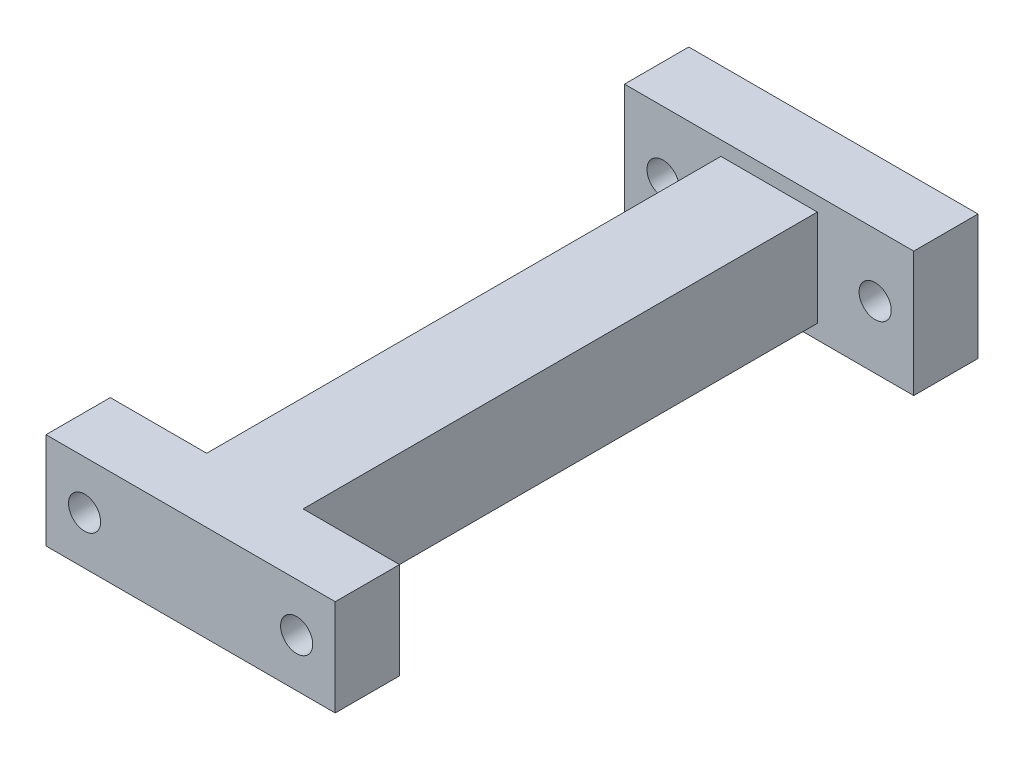
ISO-10303-21;
HEADER;
FILE_DESCRIPTION(('STEP AP214'),'2;1');
FILE_NAME('part.step','',(''),(''),'','','');
FILE_SCHEMA(('AUTOMOTIVE_DESIGN { 1 0 10303 214 1 1 1 1 }'));
ENDSEC;
DATA;
#1=APPLICATION_CONTEXT('core data for automotive mechanical design processes');
#2=APPLICATION_PROTOCOL_DEFINITION('international standard','automotive_design',2000,#1);
#3=PRODUCT_CONTEXT('',#1,'mechanical');
#4=PRODUCT('Part','Part','',(#3));
#5=PRODUCT_RELATED_PRODUCT_CATEGORY('part','',(#4));
#6=PRODUCT_DEFINITION_FORMATION('','',#4);
#7=PRODUCT_DEFINITION_CONTEXT('part definition',#1,'design');
#8=PRODUCT_DEFINITION('design','',#6,#7);
#9=PRODUCT_DEFINITION_SHAPE('','',#8);
#10=(LENGTH_UNIT() NAMED_UNIT(*) SI_UNIT(.MILLI.,.METRE.));
#11=(NAMED_UNIT(*) PLANE_ANGLE_UNIT() SI_UNIT($,.RADIAN.));
#12=(NAMED_UNIT(*) SI_UNIT($,.STERADIAN.) SOLID_ANGLE_UNIT());
#13=UNCERTAINTY_MEASURE_WITH_UNIT(LENGTH_MEASURE(1.E-05),#10,'distance_accuracy_value','');
#14=(GEOMETRIC_REPRESENTATION_CONTEXT(3) GLOBAL_UNCERTAINTY_ASSIGNED_CONTEXT((#13)) GLOBAL_UNIT_ASSIGNED_CONTEXT((#10,
#11,#12)) REPRESENTATION_CONTEXT('',''));
#15=CARTESIAN_POINT('',(0.,0.,0.));
#16=DIRECTION('',(0.,0.,1.));
#17=DIRECTION('',(1.,0.,0.));
#18=AXIS2_PLACEMENT_3D('',#15,#16,#17);
#19=CARTESIAN_POINT('',(-7.5,-7.5,100.));
#20=DIRECTION('',(1.,0.,0.));
#21=DIRECTION('',(0.,0.,-1.));
#22=AXIS2_PLACEMENT_3D('',#19,#20,#21);
#23=PLANE('',#22);
#24=DIRECTION('',(0.,1.,0.));
#25=VECTOR('',#24,1.);
#26=CARTESIAN_POINT('',(-7.5,-7.5,9.99999999999999));
#27=LINE('',#26,#25);
#28=CARTESIAN_POINT('',(-7.5,-7.5,9.99999999999999));
#29=VERTEX_POINT('',#28);
#30=CARTESIAN_POINT('',(-7.5,7.5,9.99999999999999));
#31=VERTEX_POINT('',#30);
#32=EDGE_CURVE('E66',#29,#31,#27,.T.);
#33=ORIENTED_EDGE('',*,*,#32,.F.);
#34=DIRECTION('',(0.,0.,-1.));
#35=VECTOR('',#34,1.);
#36=CARTESIAN_POINT('',(-7.5,-7.5,100.));
#37=LINE('',#36,#35);
#38=CARTESIAN_POINT('',(-7.49999999999999,-7.5,90.));
#39=VERTEX_POINT('',#38);
#40=EDGE_CURVE('E51',#39,#29,#37,.T.);
#41=ORIENTED_EDGE('',*,*,#40,.F.);
#42=DIRECTION('',(0.,-1.,0.));
#43=VECTOR('',#42,1.);
#44=CARTESIAN_POINT('',(-7.5,-7.5,90.));
#45=LINE('',#44,#43);
#46=CARTESIAN_POINT('',(-7.49999999999999,7.5,90.));
#47=VERTEX_POINT('',#46);
#48=EDGE_CURVE('E256',#47,#39,#45,.T.);
#49=ORIENTED_EDGE('',*,*,#48,.F.);
#50=DIRECTION('',(0.,0.,-1.));
#51=VECTOR('',#50,1.);
#52=CARTESIAN_POINT('',(-7.5,7.5,100.));
#53=LINE('',#52,#51);
#54=EDGE_CURVE('E265',#47,#31,#53,.T.);
#55=ORIENTED_EDGE('',*,*,#54,.T.);
#56=EDGE_LOOP('',(#33,#41,#49,#55));
#57=FACE_BOUND('',#56,.T.);
#58=ADVANCED_FACE('F43',(#57),#23,.F.);
#59=CARTESIAN_POINT('',(7.5,-7.5,100.));
#60=DIRECTION('',(-1.,0.,0.));
#61=DIRECTION('',(0.,0.,1.));
#62=AXIS2_PLACEMENT_3D('',#59,#60,#61);
#63=PLANE('',#62);
#64=DIRECTION('',(0.,-1.,0.));
#65=VECTOR('',#64,1.);
#66=CARTESIAN_POINT('',(7.5,-7.5,9.99999999999999));
#67=LINE('',#66,#65);
#68=CARTESIAN_POINT('',(7.5,7.5,9.99999999999999));
#69=VERTEX_POINT('',#68);
#70=CARTESIAN_POINT('',(7.5,-7.5,9.99999999999999));
#71=VERTEX_POINT('',#70);
#72=EDGE_CURVE('E188',#69,#71,#67,.T.);
#73=ORIENTED_EDGE('',*,*,#72,.F.);
#74=DIRECTION('',(0.,0.,-1.));
#75=VECTOR('',#74,1.);
#76=CARTESIAN_POINT('',(7.5,7.5,100.));
#77=LINE('',#76,#75);
#78=CARTESIAN_POINT('',(7.5,7.5,90.));
#79=VERTEX_POINT('',#78);
#80=EDGE_CURVE('E268',#79,#69,#77,.T.);
#81=ORIENTED_EDGE('',*,*,#80,.F.);
#82=DIRECTION('',(0.,1.,0.));
#83=VECTOR('',#82,1.);
#84=CARTESIAN_POINT('',(7.5,-7.5,90.));
#85=LINE('',#84,#83);
#86=CARTESIAN_POINT('',(7.5,-7.5,90.));
#87=VERTEX_POINT('',#86);
#88=EDGE_CURVE('E242',#87,#79,#85,.T.);
#89=ORIENTED_EDGE('',*,*,#88,.F.);
#90=DIRECTION('',(0.,0.,-1.));
#91=VECTOR('',#90,1.);
#92=CARTESIAN_POINT('',(7.5,-7.5,100.));
#93=LINE('',#92,#91);
#94=EDGE_CURVE('E271',#87,#71,#93,.T.);
#95=ORIENTED_EDGE('',*,*,#94,.T.);
#96=EDGE_LOOP('',(#73,#81,#89,#95));
#97=FACE_BOUND('',#96,.T.);
#98=ADVANCED_FACE('F301',(#97),#63,.F.);
#99=CARTESIAN_POINT('',(7.5,-7.5,100.));
#100=DIRECTION('',(0.,1.,0.));
#101=DIRECTION('',(-1.,0.,0.));
#102=AXIS2_PLACEMENT_3D('',#99,#100,#101);
#103=PLANE('',#102);
#104=DIRECTION('',(-1.,0.,0.));
#105=VECTOR('',#104,1.);
#106=CARTESIAN_POINT('',(7.5,-7.5,9.99999999999999));
#107=LINE('',#106,#105);
#108=EDGE_CURVE('E58',#71,#29,#107,.T.);
#109=ORIENTED_EDGE('',*,*,#108,.F.);
#110=ORIENTED_EDGE('',*,*,#94,.F.);
#111=DIRECTION('',(1.,0.,0.));
#112=VECTOR('',#111,1.);
#113=CARTESIAN_POINT('',(22.5,-7.5,90.));
#114=LINE('',#113,#112);
#115=CARTESIAN_POINT('',(22.5,-7.5,90.));
#116=VERTEX_POINT('',#115);
#117=EDGE_CURVE('E214',#87,#116,#114,.T.);
#118=ORIENTED_EDGE('',*,*,#117,.T.);
#119=DIRECTION('',(0.,0.,1.));
#120=VECTOR('',#119,1.);
#121=CARTESIAN_POINT('',(22.5,-7.5,90.));
#122=LINE('',#121,#120);
#123=CARTESIAN_POINT('',(22.5,-7.5,100.));
#124=VERTEX_POINT('',#123);
#125=EDGE_CURVE('E247',#116,#124,#122,.T.);
#126=ORIENTED_EDGE('',*,*,#125,.T.);
#127=DIRECTION('',(1.,0.,0.));
#128=VECTOR('',#127,1.);
#129=CARTESIAN_POINT('',(7.5,-7.5,100.));
#130=LINE('',#129,#128);
#131=CARTESIAN_POINT('',(-22.5,-7.5,100.));
#132=VERTEX_POINT('',#131);
#133=EDGE_CURVE('E259',#132,#124,#130,.T.);
#134=ORIENTED_EDGE('',*,*,#133,.F.);
#135=DIRECTION('',(0.,0.,1.));
#136=VECTOR('',#135,1.);
#137=CARTESIAN_POINT('',(-22.5,-7.5,90.));
#138=LINE('',#137,#136);
#139=CARTESIAN_POINT('',(-22.5,-7.5,90.));
#140=VERTEX_POINT('',#139);
#141=EDGE_CURVE('E229',#140,#132,#138,.T.);
#142=ORIENTED_EDGE('',*,*,#141,.F.);
#143=EDGE_CURVE('E216',#140,#39,#114,.T.);
#144=ORIENTED_EDGE('',*,*,#143,.T.);
#145=ORIENTED_EDGE('',*,*,#40,.T.);
#146=EDGE_LOOP('',(#109,#110,#118,#126,#134,#142,#144,#145));
#147=FACE_BOUND('',#146,.T.);
#148=ADVANCED_FACE('F305',(#147),#103,.F.);
#149=CARTESIAN_POINT('',(7.5,7.5,100.));
#150=DIRECTION('',(0.,-1.,0.));
#151=DIRECTION('',(1.,0.,0.));
#152=AXIS2_PLACEMENT_3D('',#149,#150,#151);
#153=PLANE('',#152);
#154=DIRECTION('',(1.,0.,0.));
#155=VECTOR('',#154,1.);
#156=CARTESIAN_POINT('',(7.5,7.5,9.99999999999999));
#157=LINE('',#156,#155);
#158=EDGE_CURVE('E11',#31,#69,#157,.T.);
#159=ORIENTED_EDGE('',*,*,#158,.F.);
#160=ORIENTED_EDGE('',*,*,#54,.F.);
#161=DIRECTION('',(-1.,0.,0.));
#162=VECTOR('',#161,1.);
#163=CARTESIAN_POINT('',(22.5,7.5,90.));
#164=LINE('',#163,#162);
#165=CARTESIAN_POINT('',(-22.5,7.5,90.));
#166=VERTEX_POINT('',#165);
#167=EDGE_CURVE('E224',#47,#166,#164,.T.);
#168=ORIENTED_EDGE('',*,*,#167,.T.);
#169=DIRECTION('',(0.,0.,1.));
#170=VECTOR('',#169,1.);
#171=CARTESIAN_POINT('',(-22.5,7.5,90.));
#172=LINE('',#171,#170);
#173=CARTESIAN_POINT('',(-22.5,7.5,100.));
#174=VERTEX_POINT('',#173);
#175=EDGE_CURVE('E238',#166,#174,#172,.T.);
#176=ORIENTED_EDGE('',*,*,#175,.T.);
#177=DIRECTION('',(-1.,0.,0.));
#178=VECTOR('',#177,1.);
#179=CARTESIAN_POINT('',(7.5,7.5,100.));
#180=LINE('',#179,#178);
#181=CARTESIAN_POINT('',(22.5,7.5,100.));
#182=VERTEX_POINT('',#181);
#183=EDGE_CURVE('E262',#182,#174,#180,.T.);
#184=ORIENTED_EDGE('',*,*,#183,.F.);
#185=DIRECTION('',(0.,0.,1.));
#186=VECTOR('',#185,1.);
#187=CARTESIAN_POINT('',(22.5,7.5,90.));
#188=LINE('',#187,#186);
#189=CARTESIAN_POINT('',(22.5,7.5,90.));
#190=VERTEX_POINT('',#189);
#191=EDGE_CURVE('E243',#190,#182,#188,.T.);
#192=ORIENTED_EDGE('',*,*,#191,.F.);
#193=EDGE_CURVE('E225',#190,#79,#164,.T.);
#194=ORIENTED_EDGE('',*,*,#193,.T.);
#195=ORIENTED_EDGE('',*,*,#80,.T.);
#196=EDGE_LOOP('',(#159,#160,#168,#176,#184,#192,#194,#195));
#197=FACE_BOUND('',#196,.T.);
#198=ADVANCED_FACE('F311',(#197),#153,.F.);
#199=CARTESIAN_POINT('',(0.,0.,100.));
#200=DIRECTION('',(0.,0.,1.));
#201=DIRECTION('',(1.,0.,0.));
#202=AXIS2_PLACEMENT_3D('',#199,#200,#201);
#203=PLANE('',#202);
#204=CARTESIAN_POINT('',(-16.5,0.,100.));
#205=DIRECTION('',(0.,0.,1.));
#206=DIRECTION('',(1.,0.,0.));
#207=AXIS2_PLACEMENT_3D('',#204,#205,#206);
#208=CIRCLE('',#207,2.5);
#209=CARTESIAN_POINT('',(-14.,0.,100.));
#210=VERTEX_POINT('',#209);
#211=EDGE_CURVE('E202',#210,#210,#208,.T.);
#212=ORIENTED_EDGE('',*,*,#211,.F.);
#213=EDGE_LOOP('',(#212));
#214=FACE_BOUND('',#213,.T.);
#215=CARTESIAN_POINT('',(16.5,0.,100.));
#216=DIRECTION('',(0.,0.,1.));
#217=DIRECTION('',(-1.,0.,0.));
#218=AXIS2_PLACEMENT_3D('',#215,#216,#217);
#219=CIRCLE('',#218,2.5);
#220=CARTESIAN_POINT('',(14.,0.,100.));
#221=VERTEX_POINT('',#220);
#222=EDGE_CURVE('E201',#221,#221,#219,.T.);
#223=ORIENTED_EDGE('',*,*,#222,.F.);
#224=EDGE_LOOP('',(#223));
#225=FACE_BOUND('',#224,.T.);
#226=ORIENTED_EDGE('',*,*,#183,.T.);
#227=DIRECTION('',(0.,-1.,0.));
#228=VECTOR('',#227,1.);
#229=CARTESIAN_POINT('',(-22.5,-7.5,100.));
#230=LINE('',#229,#228);
#231=EDGE_CURVE('E230',#174,#132,#230,.T.);
#232=ORIENTED_EDGE('',*,*,#231,.T.);
#233=ORIENTED_EDGE('',*,*,#133,.T.);
#234=DIRECTION('',(0.,1.,0.));
#235=VECTOR('',#234,1.);
#236=CARTESIAN_POINT('',(22.5,-7.5,100.));
#237=LINE('',#236,#235);
#238=EDGE_CURVE('E215',#124,#182,#237,.T.);
#239=ORIENTED_EDGE('',*,*,#238,.T.);
#240=EDGE_LOOP('',(#226,#232,#233,#239));
#241=FACE_BOUND('',#240,.T.);
#242=ADVANCED_FACE('F316',(#214,#225,#241),#203,.T.);
#243=CARTESIAN_POINT('',(22.5,-7.5,90.));
#244=DIRECTION('',(1.,0.,0.));
#245=DIRECTION('',(0.,0.,-1.));
#246=AXIS2_PLACEMENT_3D('',#243,#244,#245);
#247=PLANE('',#246);
#248=ORIENTED_EDGE('',*,*,#238,.F.);
#249=ORIENTED_EDGE('',*,*,#125,.F.);
#250=DIRECTION('',(0.,1.,0.));
#251=VECTOR('',#250,1.);
#252=CARTESIAN_POINT('',(22.5,-7.5,90.));
#253=LINE('',#252,#251);
#254=EDGE_CURVE('E220',#116,#190,#253,.T.);
#255=ORIENTED_EDGE('',*,*,#254,.T.);
#256=ORIENTED_EDGE('',*,*,#191,.T.);
#257=EDGE_LOOP('',(#248,#249,#255,#256));
#258=FACE_BOUND('',#257,.T.);
#259=ADVANCED_FACE('F325',(#258),#247,.T.);
#260=CARTESIAN_POINT('',(0.,0.,90.));
#261=DIRECTION('',(0.,0.,1.));
#262=DIRECTION('',(1.,0.,0.));
#263=AXIS2_PLACEMENT_3D('',#260,#261,#262);
#264=PLANE('',#263);
#265=CARTESIAN_POINT('',(16.5,0.,90.));
#266=DIRECTION('',(0.,0.,1.));
#267=DIRECTION('',(1.,0.,0.));
#268=AXIS2_PLACEMENT_3D('',#265,#266,#267);
#269=CIRCLE('',#268,2.5);
#270=CARTESIAN_POINT('',(19.,0.,90.));
#271=VERTEX_POINT('',#270);
#272=EDGE_CURVE('E234',#271,#271,#269,.T.);
#273=ORIENTED_EDGE('',*,*,#272,.T.);
#274=EDGE_LOOP('',(#273));
#275=FACE_BOUND('',#274,.T.);
#276=ORIENTED_EDGE('',*,*,#117,.F.);
#277=ORIENTED_EDGE('',*,*,#88,.T.);
#278=ORIENTED_EDGE('',*,*,#193,.F.);
#279=ORIENTED_EDGE('',*,*,#254,.F.);
#280=EDGE_LOOP('',(#276,#277,#278,#279));
#281=FACE_BOUND('',#280,.T.);
#282=ADVANCED_FACE('F282',(#275,#281),#264,.F.);
#283=CARTESIAN_POINT('',(-16.5,0.,90.));
#284=DIRECTION('',(0.,0.,1.));
#285=DIRECTION('',(1.,0.,0.));
#286=AXIS2_PLACEMENT_3D('',#283,#284,#285);
#287=CIRCLE('',#286,2.5);
#288=CARTESIAN_POINT('',(-14.,0.,90.));
#289=VERTEX_POINT('',#288);
#290=EDGE_CURVE('E206',#289,#289,#287,.T.);
#291=ORIENTED_EDGE('',*,*,#290,.T.);
#292=EDGE_LOOP('',(#291));
#293=FACE_BOUND('',#292,.T.);
#294=ORIENTED_EDGE('',*,*,#167,.F.);
#295=ORIENTED_EDGE('',*,*,#48,.T.);
#296=ORIENTED_EDGE('',*,*,#143,.F.);
#297=DIRECTION('',(0.,-1.,0.));
#298=VECTOR('',#297,1.);
#299=CARTESIAN_POINT('',(-22.5,-7.5,90.));
#300=LINE('',#299,#298);
#301=EDGE_CURVE('E210',#166,#140,#300,.T.);
#302=ORIENTED_EDGE('',*,*,#301,.F.);
#303=EDGE_LOOP('',(#294,#295,#296,#302));
#304=FACE_BOUND('',#303,.T.);
#305=ADVANCED_FACE('F329',(#293,#304),#264,.F.);
#306=CARTESIAN_POINT('',(-22.5,-7.5,90.));
#307=DIRECTION('',(-1.,0.,0.));
#308=DIRECTION('',(0.,0.,1.));
#309=AXIS2_PLACEMENT_3D('',#306,#307,#308);
#310=PLANE('',#309);
#311=ORIENTED_EDGE('',*,*,#231,.F.);
#312=ORIENTED_EDGE('',*,*,#175,.F.);
#313=ORIENTED_EDGE('',*,*,#301,.T.);
#314=ORIENTED_EDGE('',*,*,#141,.T.);
#315=EDGE_LOOP('',(#311,#312,#313,#314));
#316=FACE_BOUND('',#315,.T.);
#317=ADVANCED_FACE('F296',(#316),#310,.T.);
#318=CARTESIAN_POINT('',(-16.5,0.,80.));
#319=DIRECTION('',(0.,0.,1.));
#320=DIRECTION('',(1.,0.,0.));
#321=AXIS2_PLACEMENT_3D('',#318,#319,#320);
#322=CYLINDRICAL_SURFACE('',#321,2.5);
#323=ORIENTED_EDGE('',*,*,#211,.T.);
#324=EDGE_LOOP('',(#323));
#325=FACE_BOUND('',#324,.T.);
#326=ORIENTED_EDGE('',*,*,#290,.F.);
#327=EDGE_LOOP('',(#326));
#328=FACE_BOUND('',#327,.T.);
#329=ADVANCED_FACE('F287',(#325,#328),#322,.F.);
#330=CARTESIAN_POINT('',(16.5,0.,80.));
#331=DIRECTION('',(0.,0.,1.));
#332=DIRECTION('',(1.,0.,0.));
#333=AXIS2_PLACEMENT_3D('',#330,#331,#332);
#334=CYLINDRICAL_SURFACE('',#333,2.5);
#335=ORIENTED_EDGE('',*,*,#222,.T.);
#336=EDGE_LOOP('',(#335));
#337=FACE_BOUND('',#336,.T.);
#338=ORIENTED_EDGE('',*,*,#272,.F.);
#339=EDGE_LOOP('',(#338));
#340=FACE_BOUND('',#339,.T.);
#341=ADVANCED_FACE('F285',(#337,#340),#334,.F.);
#342=CARTESIAN_POINT('',(0.,0.,10.));
#343=DIRECTION('',(0.,0.,-1.));
#344=DIRECTION('',(-1.,0.,0.));
#345=AXIS2_PLACEMENT_3D('',#342,#343,#344);
#346=PLANE('',#345);
#347=CARTESIAN_POINT('',(16.5,0.,9.99999999999999));
#348=DIRECTION('',(0.,0.,-1.));
#349=DIRECTION('',(-1.,0.,0.));
#350=AXIS2_PLACEMENT_3D('',#347,#348,#349);
#351=CIRCLE('',#350,2.5);
#352=CARTESIAN_POINT('',(14.,0.,9.99999999999999));
#353=VERTEX_POINT('',#352);
#354=EDGE_CURVE('E171',#353,#353,#351,.T.);
#355=ORIENTED_EDGE('',*,*,#354,.T.);
#356=EDGE_LOOP('',(#355));
#357=FACE_BOUND('',#356,.T.);
#358=CARTESIAN_POINT('',(-16.5,0.,9.99999999999999));
#359=DIRECTION('',(0.,0.,-1.));
#360=DIRECTION('',(-1.,0.,0.));
#361=AXIS2_PLACEMENT_3D('',#358,#359,#360);
#362=CIRCLE('',#361,2.5);
#363=CARTESIAN_POINT('',(-19.,0.,9.99999999999999));
#364=VERTEX_POINT('',#363);
#365=EDGE_CURVE('E540',#364,#364,#362,.T.);
#366=ORIENTED_EDGE('',*,*,#365,.T.);
#367=EDGE_LOOP('',(#366));
#368=FACE_BOUND('',#367,.T.);
#369=DIRECTION('',(0.,-1.,0.));
#370=VECTOR('',#369,1.);
#371=CARTESIAN_POINT('',(22.5,-9.73638284610195,10.));
#372=LINE('',#371,#370);
#373=CARTESIAN_POINT('',(22.5,9.73638284610195,10.));
#374=VERTEX_POINT('',#373);
#375=CARTESIAN_POINT('',(22.5,-9.73638284610195,10.));
#376=VERTEX_POINT('',#375);
#377=EDGE_CURVE('E155',#374,#376,#372,.T.);
#378=ORIENTED_EDGE('',*,*,#377,.F.);
#379=DIRECTION('',(1.,0.,0.));
#380=VECTOR('',#379,1.);
#381=CARTESIAN_POINT('',(-22.5,9.73638284610195,10.));
#382=LINE('',#381,#380);
#383=CARTESIAN_POINT('',(-22.5,9.73638284610195,10.));
#384=VERTEX_POINT('',#383);
#385=EDGE_CURVE('E147',#384,#374,#382,.T.);
#386=ORIENTED_EDGE('',*,*,#385,.F.);
#387=DIRECTION('',(0.,1.,0.));
#388=VECTOR('',#387,1.);
#389=CARTESIAN_POINT('',(-22.5,-9.73638284610194,10.));
#390=LINE('',#389,#388);
#391=CARTESIAN_POINT('',(-22.5,-9.73638284610194,10.));
#392=VERTEX_POINT('',#391);
#393=EDGE_CURVE('E158',#392,#384,#390,.T.);
#394=ORIENTED_EDGE('',*,*,#393,.F.);
#395=DIRECTION('',(-1.,0.,0.));
#396=VECTOR('',#395,1.);
#397=CARTESIAN_POINT('',(-22.5,-9.73638284610194,10.));
#398=LINE('',#397,#396);
#399=EDGE_CURVE('E138',#376,#392,#398,.T.);
#400=ORIENTED_EDGE('',*,*,#399,.F.);
#401=EDGE_LOOP('',(#378,#386,#394,#400));
#402=FACE_BOUND('',#401,.T.);
#403=ORIENTED_EDGE('',*,*,#72,.T.);
#404=ORIENTED_EDGE('',*,*,#108,.T.);
#405=ORIENTED_EDGE('',*,*,#32,.T.);
#406=ORIENTED_EDGE('',*,*,#158,.T.);
#407=EDGE_LOOP('',(#403,#404,#405,#406));
#408=FACE_BOUND('',#407,.T.);
#409=ADVANCED_FACE('F152',(#357,#368,#402,#408),#346,.F.);
#410=CARTESIAN_POINT('',(22.5,-9.73638284610195,10.));
#411=DIRECTION('',(1.,0.,0.));
#412=DIRECTION('',(0.,0.,-1.));
#413=AXIS2_PLACEMENT_3D('',#410,#411,#412);
#414=PLANE('',#413);
#415=DIRECTION('',(0.,-1.,0.));
#416=VECTOR('',#415,1.);
#417=CARTESIAN_POINT('',(22.5,-9.73638284610195,0.));
#418=LINE('',#417,#416);
#419=CARTESIAN_POINT('',(22.5,9.73638284610195,0.));
#420=VERTEX_POINT('',#419);
#421=CARTESIAN_POINT('',(22.5,-9.73638284610195,0.));
#422=VERTEX_POINT('',#421);
#423=EDGE_CURVE('E178',#420,#422,#418,.T.);
#424=ORIENTED_EDGE('',*,*,#423,.F.);
#425=DIRECTION('',(0.,0.,-1.));
#426=VECTOR('',#425,1.);
#427=CARTESIAN_POINT('',(22.5,9.73638284610195,10.));
#428=LINE('',#427,#426);
#429=EDGE_CURVE('E162',#374,#420,#428,.T.);
#430=ORIENTED_EDGE('',*,*,#429,.F.);
#431=ORIENTED_EDGE('',*,*,#377,.T.);
#432=DIRECTION('',(0.,0.,-1.));
#433=VECTOR('',#432,1.);
#434=CARTESIAN_POINT('',(22.5,-9.73638284610195,10.));
#435=LINE('',#434,#433);
#436=EDGE_CURVE('E135',#376,#422,#435,.T.);
#437=ORIENTED_EDGE('',*,*,#436,.T.);
#438=EDGE_LOOP('',(#424,#430,#431,#437));
#439=FACE_BOUND('',#438,.T.);
#440=ADVANCED_FACE('F161',(#439),#414,.T.);
#441=CARTESIAN_POINT('',(-22.5,9.73638284610195,10.));
#442=DIRECTION('',(0.,1.,0.));
#443=DIRECTION('',(-1.,0.,0.));
#444=AXIS2_PLACEMENT_3D('',#441,#442,#443);
#445=PLANE('',#444);
#446=DIRECTION('',(1.,0.,0.));
#447=VECTOR('',#446,1.);
#448=CARTESIAN_POINT('',(-22.5,9.73638284610195,0.));
#449=LINE('',#448,#447);
#450=CARTESIAN_POINT('',(-22.5,9.73638284610195,0.));
#451=VERTEX_POINT('',#450);
#452=EDGE_CURVE('E164',#451,#420,#449,.T.);
#453=ORIENTED_EDGE('',*,*,#452,.F.);
#454=DIRECTION('',(0.,0.,-1.));
#455=VECTOR('',#454,1.);
#456=CARTESIAN_POINT('',(-22.5,9.73638284610195,10.));
#457=LINE('',#456,#455);
#458=EDGE_CURVE('E189',#384,#451,#457,.T.);
#459=ORIENTED_EDGE('',*,*,#458,.F.);
#460=ORIENTED_EDGE('',*,*,#385,.T.);
#461=ORIENTED_EDGE('',*,*,#429,.T.);
#462=EDGE_LOOP('',(#453,#459,#460,#461));
#463=FACE_BOUND('',#462,.T.);
#464=ADVANCED_FACE('F494',(#463),#445,.T.);
#465=CARTESIAN_POINT('',(-22.5,-9.73638284610194,10.));
#466=DIRECTION('',(-1.,0.,0.));
#467=DIRECTION('',(0.,0.,1.));
#468=AXIS2_PLACEMENT_3D('',#465,#466,#467);
#469=PLANE('',#468);
#470=DIRECTION('',(0.,1.,0.));
#471=VECTOR('',#470,1.);
#472=CARTESIAN_POINT('',(-22.5,-9.73638284610194,0.));
#473=LINE('',#472,#471);
#474=CARTESIAN_POINT('',(-22.5,-9.73638284610194,0.));
#475=VERTEX_POINT('',#474);
#476=EDGE_CURVE('E168',#475,#451,#473,.T.);
#477=ORIENTED_EDGE('',*,*,#476,.F.);
#478=DIRECTION('',(0.,0.,-1.));
#479=VECTOR('',#478,1.);
#480=CARTESIAN_POINT('',(-22.5,-9.73638284610194,10.));
#481=LINE('',#480,#479);
#482=EDGE_CURVE('E146',#392,#475,#481,.T.);
#483=ORIENTED_EDGE('',*,*,#482,.F.);
#484=ORIENTED_EDGE('',*,*,#393,.T.);
#485=ORIENTED_EDGE('',*,*,#458,.T.);
#486=EDGE_LOOP('',(#477,#483,#484,#485));
#487=FACE_BOUND('',#486,.T.);
#488=ADVANCED_FACE('F488',(#487),#469,.T.);
#489=CARTESIAN_POINT('',(-22.5,-9.73638284610194,10.));
#490=DIRECTION('',(0.,-1.,0.));
#491=DIRECTION('',(1.,0.,0.));
#492=AXIS2_PLACEMENT_3D('',#489,#490,#491);
#493=PLANE('',#492);
#494=DIRECTION('',(-1.,0.,0.));
#495=VECTOR('',#494,1.);
#496=CARTESIAN_POINT('',(-22.5,-9.73638284610194,0.));
#497=LINE('',#496,#495);
#498=EDGE_CURVE('E140',#422,#475,#497,.T.);
#499=ORIENTED_EDGE('',*,*,#498,.F.);
#500=ORIENTED_EDGE('',*,*,#436,.F.);
#501=ORIENTED_EDGE('',*,*,#399,.T.);
#502=ORIENTED_EDGE('',*,*,#482,.T.);
#503=EDGE_LOOP('',(#499,#500,#501,#502));
#504=FACE_BOUND('',#503,.T.);
#505=ADVANCED_FACE('F137',(#504),#493,.T.);
#506=CARTESIAN_POINT('',(0.,0.,0.));
#507=DIRECTION('',(0.,0.,1.));
#508=DIRECTION('',(1.,0.,0.));
#509=AXIS2_PLACEMENT_3D('',#506,#507,#508);
#510=PLANE('',#509);
#511=CARTESIAN_POINT('',(16.5,0.,0.));
#512=DIRECTION('',(0.,0.,-1.));
#513=DIRECTION('',(-1.,0.,0.));
#514=AXIS2_PLACEMENT_3D('',#511,#512,#513);
#515=CIRCLE('',#514,2.5);
#516=CARTESIAN_POINT('',(14.,0.,0.));
#517=VERTEX_POINT('',#516);
#518=EDGE_CURVE('E536',#517,#517,#515,.T.);
#519=ORIENTED_EDGE('',*,*,#518,.F.);
#520=EDGE_LOOP('',(#519));
#521=FACE_BOUND('',#520,.T.);
#522=CARTESIAN_POINT('',(-16.5,0.,0.));
#523=DIRECTION('',(0.,0.,-1.));
#524=DIRECTION('',(-1.,0.,0.));
#525=AXIS2_PLACEMENT_3D('',#522,#523,#524);
#526=CIRCLE('',#525,2.5);
#527=CARTESIAN_POINT('',(-19.,0.,0.));
#528=VERTEX_POINT('',#527);
#529=EDGE_CURVE('E546',#528,#528,#526,.T.);
#530=ORIENTED_EDGE('',*,*,#529,.F.);
#531=EDGE_LOOP('',(#530));
#532=FACE_BOUND('',#531,.T.);
#533=ORIENTED_EDGE('',*,*,#423,.T.);
#534=ORIENTED_EDGE('',*,*,#498,.T.);
#535=ORIENTED_EDGE('',*,*,#476,.T.);
#536=ORIENTED_EDGE('',*,*,#452,.T.);
#537=EDGE_LOOP('',(#533,#534,#535,#536));
#538=FACE_BOUND('',#537,.T.);
#539=ADVANCED_FACE('F318',(#521,#532,#538),#510,.F.);
#540=CARTESIAN_POINT('',(-16.5,0.,100.));
#541=DIRECTION('',(0.,0.,-1.));
#542=DIRECTION('',(-1.,0.,0.));
#543=AXIS2_PLACEMENT_3D('',#540,#541,#542);
#544=CYLINDRICAL_SURFACE('',#543,2.5);
#545=ORIENTED_EDGE('',*,*,#529,.T.);
#546=EDGE_LOOP('',(#545));
#547=FACE_BOUND('',#546,.T.);
#548=ORIENTED_EDGE('',*,*,#365,.F.);
#549=EDGE_LOOP('',(#548));
#550=FACE_BOUND('',#549,.T.);
#551=ADVANCED_FACE('F321',(#547,#550),#544,.F.);
#552=CARTESIAN_POINT('',(16.5,0.,100.));
#553=DIRECTION('',(0.,0.,-1.));
#554=DIRECTION('',(-1.,0.,0.));
#555=AXIS2_PLACEMENT_3D('',#552,#553,#554);
#556=CYLINDRICAL_SURFACE('',#555,2.5);
#557=ORIENTED_EDGE('',*,*,#518,.T.);
#558=EDGE_LOOP('',(#557));
#559=FACE_BOUND('',#558,.T.);
#560=ORIENTED_EDGE('',*,*,#354,.F.);
#561=EDGE_LOOP('',(#560));
#562=FACE_BOUND('',#561,.T.);
#563=ADVANCED_FACE('F468',(#559,#562),#556,.F.);
#564=CLOSED_SHELL('',(#58,#98,#148,#198,#242,#259,#282,#305,#317,#329,#341,#409,#440,#464,#488,
#505,#539,#551,#563));
#565=MANIFOLD_SOLID_BREP('B2',#564);
#566=ADVANCED_BREP_SHAPE_REPRESENTATION('',(#18,#565),#14);
#567=SHAPE_DEFINITION_REPRESENTATION(#9,#566);
ENDSEC;
END-ISO-10303-21;
